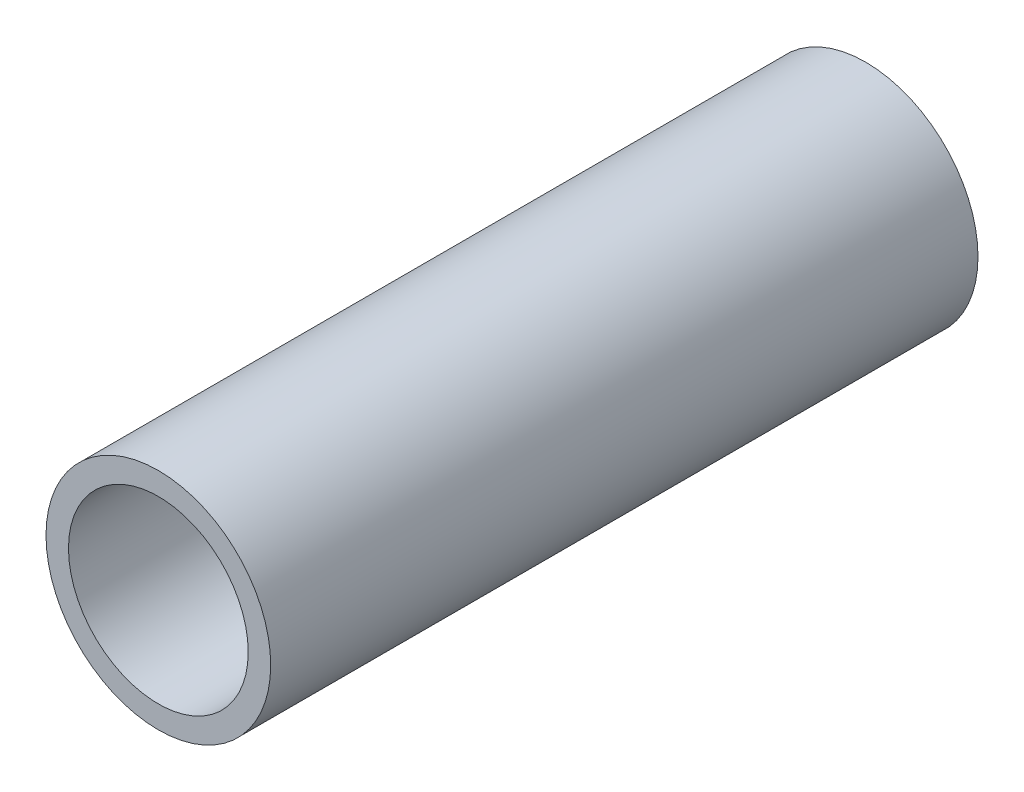
ISO-10303-21;
HEADER;
FILE_DESCRIPTION(('STEP AP214'),'2;1');
FILE_NAME('part.step','',(''),(''),'','','');
FILE_SCHEMA(('AUTOMOTIVE_DESIGN { 1 0 10303 214 1 1 1 1 }'));
ENDSEC;
DATA;
#1=APPLICATION_CONTEXT('core data for automotive mechanical design processes');
#2=APPLICATION_PROTOCOL_DEFINITION('international standard','automotive_design',2000,#1);
#3=PRODUCT_CONTEXT('',#1,'mechanical');
#4=PRODUCT('Part','Part','',(#3));
#5=PRODUCT_RELATED_PRODUCT_CATEGORY('part','',(#4));
#6=PRODUCT_DEFINITION_FORMATION('','',#4);
#7=PRODUCT_DEFINITION_CONTEXT('part definition',#1,'design');
#8=PRODUCT_DEFINITION('design','',#6,#7);
#9=PRODUCT_DEFINITION_SHAPE('','',#8);
#10=(LENGTH_UNIT() NAMED_UNIT(*) SI_UNIT(.MILLI.,.METRE.));
#11=(NAMED_UNIT(*) PLANE_ANGLE_UNIT() SI_UNIT($,.RADIAN.));
#12=(NAMED_UNIT(*) SI_UNIT($,.STERADIAN.) SOLID_ANGLE_UNIT());
#13=UNCERTAINTY_MEASURE_WITH_UNIT(LENGTH_MEASURE(1.E-05),#10,'distance_accuracy_value','');
#14=(GEOMETRIC_REPRESENTATION_CONTEXT(3) GLOBAL_UNCERTAINTY_ASSIGNED_CONTEXT((#13)) GLOBAL_UNIT_ASSIGNED_CONTEXT((#10,
#11,#12)) REPRESENTATION_CONTEXT('',''));
#15=CARTESIAN_POINT('',(0.,0.,0.));
#16=DIRECTION('',(0.,0.,1.));
#17=DIRECTION('',(1.,0.,0.));
#18=AXIS2_PLACEMENT_3D('',#15,#16,#17);
#19=CARTESIAN_POINT('',(0.,0.,3.99795999999999));
#20=DIRECTION('',(0.,0.,1.));
#21=DIRECTION('',(1.,0.,0.));
#22=AXIS2_PLACEMENT_3D('',#19,#20,#21);
#23=PLANE('',#22);
#24=CARTESIAN_POINT('',(0.,0.,3.99795999999999));
#25=DIRECTION('',(0.,0.,1.));
#26=DIRECTION('',(1.,0.,0.));
#27=AXIS2_PLACEMENT_3D('',#24,#25,#26);
#28=CIRCLE('',#27,0.635);
#29=CARTESIAN_POINT('',(-0.634999999999986,0.,3.99796));
#30=VERTEX_POINT('',#29);
#31=EDGE_CURVE('E10',#30,#30,#28,.T.);
#32=ORIENTED_EDGE('',*,*,#31,.T.);
#33=EDGE_LOOP('',(#32));
#34=FACE_BOUND('',#33,.T.);
#35=CARTESIAN_POINT('',(0.,0.,3.99795999999999));
#36=DIRECTION('',(0.,0.,1.));
#37=DIRECTION('',(1.,0.,0.));
#38=AXIS2_PLACEMENT_3D('',#35,#36,#37);
#39=CIRCLE('',#38,0.508);
#40=CARTESIAN_POINT('',(-0.507999999999986,0.,3.99796));
#41=VERTEX_POINT('',#40);
#42=EDGE_CURVE('E52',#41,#41,#39,.T.);
#43=ORIENTED_EDGE('',*,*,#42,.F.);
#44=EDGE_LOOP('',(#43));
#45=FACE_BOUND('',#44,.T.);
#46=ADVANCED_FACE('F39',(#34,#45),#23,.T.);
#47=CARTESIAN_POINT('',(0.,0.,0.));
#48=DIRECTION('',(0.,0.,1.));
#49=DIRECTION('',(1.,0.,0.));
#50=AXIS2_PLACEMENT_3D('',#47,#48,#49);
#51=PLANE('',#50);
#52=CARTESIAN_POINT('',(0.,0.,0.));
#53=DIRECTION('',(0.,0.,1.));
#54=DIRECTION('',(1.,0.,0.));
#55=AXIS2_PLACEMENT_3D('',#52,#53,#54);
#56=CIRCLE('',#55,0.635);
#57=CARTESIAN_POINT('',(-0.634999999999986,0.,0.));
#58=VERTEX_POINT('',#57);
#59=EDGE_CURVE('E43',#58,#58,#56,.T.);
#60=ORIENTED_EDGE('',*,*,#59,.F.);
#61=EDGE_LOOP('',(#60));
#62=FACE_BOUND('',#61,.T.);
#63=CARTESIAN_POINT('',(0.,0.,0.));
#64=DIRECTION('',(0.,0.,1.));
#65=DIRECTION('',(1.,0.,0.));
#66=AXIS2_PLACEMENT_3D('',#63,#64,#65);
#67=CIRCLE('',#66,0.508);
#68=CARTESIAN_POINT('',(-0.507999999999986,0.,0.));
#69=VERTEX_POINT('',#68);
#70=EDGE_CURVE('E54',#69,#69,#67,.T.);
#71=ORIENTED_EDGE('',*,*,#70,.T.);
#72=EDGE_LOOP('',(#71));
#73=FACE_BOUND('',#72,.T.);
#74=ADVANCED_FACE('F66',(#62,#73),#51,.F.);
#75=CARTESIAN_POINT('',(0.,0.,3.99795999999999));
#76=DIRECTION('',(0.,0.,-1.));
#77=DIRECTION('',(-1.,0.,0.));
#78=AXIS2_PLACEMENT_3D('',#75,#76,#77);
#79=CYLINDRICAL_SURFACE('',#78,0.635);
#80=CARTESIAN_POINT('',(-0.634999999999986,0.,3.99796));
#81=CARTESIAN_POINT('',(-0.634999999999986,0.,3.95631458333333));
#82=CARTESIAN_POINT('',(-0.634999999999986,0.,3.91466916666666));
#83=CARTESIAN_POINT('',(-0.634999999999986,0.,3.83137833333333));
#84=CARTESIAN_POINT('',(-0.634999999999986,0.,3.78973291666666));
#85=CARTESIAN_POINT('',(-0.634999999999986,0.,3.70644208333333));
#86=CARTESIAN_POINT('',(-0.634999999999986,0.,3.66479666666666));
#87=CARTESIAN_POINT('',(-0.634999999999986,0.,3.58150583333333));
#88=CARTESIAN_POINT('',(-0.634999999999986,0.,3.53986041666666));
#89=CARTESIAN_POINT('',(-0.634999999999986,0.,3.45656958333333));
#90=CARTESIAN_POINT('',(-0.634999999999986,0.,3.41492416666666));
#91=CARTESIAN_POINT('',(-0.634999999999986,0.,3.33163333333333));
#92=CARTESIAN_POINT('',(-0.634999999999986,0.,3.28998791666666));
#93=CARTESIAN_POINT('',(-0.634999999999986,0.,3.20669708333333));
#94=CARTESIAN_POINT('',(-0.634999999999986,0.,3.16505166666666));
#95=CARTESIAN_POINT('',(-0.634999999999986,0.,3.08176083333333));
#96=CARTESIAN_POINT('',(-0.634999999999986,0.,3.04011541666666));
#97=CARTESIAN_POINT('',(-0.634999999999986,0.,2.95682458333333));
#98=CARTESIAN_POINT('',(-0.634999999999986,0.,2.91517916666666));
#99=CARTESIAN_POINT('',(-0.634999999999986,0.,2.83188833333333));
#100=CARTESIAN_POINT('',(-0.634999999999986,0.,2.79024291666666));
#101=CARTESIAN_POINT('',(-0.634999999999986,0.,2.70695208333333));
#102=CARTESIAN_POINT('',(-0.634999999999986,0.,2.66530666666666));
#103=CARTESIAN_POINT('',(-0.634999999999986,0.,2.58201583333333));
#104=CARTESIAN_POINT('',(-0.634999999999986,0.,2.54037041666666));
#105=CARTESIAN_POINT('',(-0.634999999999986,0.,2.45707958333333));
#106=CARTESIAN_POINT('',(-0.634999999999986,0.,2.41543416666666));
#107=CARTESIAN_POINT('',(-0.634999999999986,0.,2.33214333333333));
#108=CARTESIAN_POINT('',(-0.634999999999986,0.,2.29049791666666));
#109=CARTESIAN_POINT('',(-0.634999999999986,0.,2.20720708333333));
#110=CARTESIAN_POINT('',(-0.634999999999986,0.,2.16556166666666));
#111=CARTESIAN_POINT('',(-0.634999999999986,0.,2.08227083333333));
#112=CARTESIAN_POINT('',(-0.634999999999986,0.,2.04062541666666));
#113=CARTESIAN_POINT('',(-0.634999999999986,0.,1.95733458333333));
#114=CARTESIAN_POINT('',(-0.634999999999986,0.,1.91568916666666));
#115=CARTESIAN_POINT('',(-0.634999999999986,0.,1.83239833333333));
#116=CARTESIAN_POINT('',(-0.634999999999986,0.,1.79075291666666));
#117=CARTESIAN_POINT('',(-0.634999999999986,0.,1.70746208333333));
#118=CARTESIAN_POINT('',(-0.634999999999986,0.,1.66581666666666));
#119=CARTESIAN_POINT('',(-0.634999999999986,0.,1.58252583333333));
#120=CARTESIAN_POINT('',(-0.634999999999986,0.,1.54088041666666));
#121=CARTESIAN_POINT('',(-0.634999999999986,0.,1.45758958333333));
#122=CARTESIAN_POINT('',(-0.634999999999986,0.,1.41594416666666));
#123=CARTESIAN_POINT('',(-0.634999999999986,0.,1.33265333333333));
#124=CARTESIAN_POINT('',(-0.634999999999986,0.,1.29100791666667));
#125=CARTESIAN_POINT('',(-0.634999999999986,0.,1.20771708333333));
#126=CARTESIAN_POINT('',(-0.634999999999986,0.,1.16607166666667));
#127=CARTESIAN_POINT('',(-0.634999999999986,0.,1.08278083333333));
#128=CARTESIAN_POINT('',(-0.634999999999986,0.,1.04113541666667));
#129=CARTESIAN_POINT('',(-0.634999999999986,0.,0.957844583333332));
#130=CARTESIAN_POINT('',(-0.634999999999986,0.,0.916199166666665));
#131=CARTESIAN_POINT('',(-0.634999999999986,0.,0.832908333333332));
#132=CARTESIAN_POINT('',(-0.634999999999986,0.,0.791262916666665));
#133=CARTESIAN_POINT('',(-0.634999999999986,0.,0.707972083333332));
#134=CARTESIAN_POINT('',(-0.634999999999986,0.,0.666326666666665));
#135=CARTESIAN_POINT('',(-0.634999999999986,0.,0.583035833333332));
#136=CARTESIAN_POINT('',(-0.634999999999986,0.,0.541390416666666));
#137=CARTESIAN_POINT('',(-0.634999999999986,0.,0.458099583333333));
#138=CARTESIAN_POINT('',(-0.634999999999986,0.,0.416454166666666));
#139=CARTESIAN_POINT('',(-0.634999999999986,0.,0.333163333333333));
#140=CARTESIAN_POINT('',(-0.634999999999986,0.,0.291517916666666));
#141=CARTESIAN_POINT('',(-0.634999999999986,0.,0.208227083333333));
#142=CARTESIAN_POINT('',(-0.634999999999986,0.,0.166581666666666));
#143=CARTESIAN_POINT('',(-0.634999999999986,0.,0.083290833333333));
#144=CARTESIAN_POINT('',(-0.634999999999986,0.,0.0416454166666665));
#145=CARTESIAN_POINT('',(-0.634999999999986,0.,0.));
#146=B_SPLINE_CURVE_WITH_KNOTS('',3,(#80,#81,#82,#83,#84,#85,#86,#87,#88,#89,#90,#91,#92,#93,
#94,#95,#96,#97,#98,#99,#100,#101,#102,#103,#104,#105,#106,#107,#108,#109,#110,#111,#112,#113,
#114,#115,#116,#117,#118,#119,#120,#121,#122,#123,#124,#125,#126,#127,#128,#129,#130,#131,#132,
#133,#134,#135,#136,#137,#138,#139,#140,#141,#142,#143,#144,#145),.UNSPECIFIED.,.F.,.F.,(4,2,2,
2,2,2,2,2,2,2,2,2,2,2,2,2,2,2,2,2,2,2,2,2,2,2,2,2,2,2,2,2,4),(0.,0.12493625,0.2498725,
0.37480875,0.499745,0.62468125,0.749617499999999,0.874553749999999,0.99949,1.12442625,1.2493625,
1.37429875,1.499235,1.62417125,1.7491075,1.87404375,1.99898,2.12391625,2.2488525,2.37378875,
2.498725,2.62366125,2.7485975,2.87353375,2.99847,3.12340625,3.2483425,3.37327875,3.498215,
3.62315125,3.7480875,3.87302375,3.99796),.UNSPECIFIED.);
#147=EDGE_CURVE('BSEAM41',#30,#58,#146,.T.);
#148=ORIENTED_EDGE('',*,*,#31,.F.);
#149=ORIENTED_EDGE('',*,*,#59,.T.);
#150=ORIENTED_EDGE('',*,*,#147,.T.);
#151=ORIENTED_EDGE('',*,*,#147,.F.);
#152=EDGE_LOOP('',(#148,#150,#149,#151));
#153=FACE_BOUND('',#152,.T.);
#154=ADVANCED_FACE('F41',(#153),#79,.T.);
#155=CARTESIAN_POINT('',(0.,0.,3.99795999999999));
#156=DIRECTION('',(0.,0.,-1.));
#157=DIRECTION('',(-1.,0.,0.));
#158=AXIS2_PLACEMENT_3D('',#155,#156,#157);
#159=CYLINDRICAL_SURFACE('',#158,0.508);
#160=CARTESIAN_POINT('',(-0.507999999999986,0.,3.99796));
#161=CARTESIAN_POINT('',(-0.507999999999986,0.,3.95631458333333));
#162=CARTESIAN_POINT('',(-0.507999999999986,0.,3.91466916666666));
#163=CARTESIAN_POINT('',(-0.507999999999986,0.,3.83137833333333));
#164=CARTESIAN_POINT('',(-0.507999999999986,0.,3.78973291666666));
#165=CARTESIAN_POINT('',(-0.507999999999986,0.,3.70644208333333));
#166=CARTESIAN_POINT('',(-0.507999999999986,0.,3.66479666666666));
#167=CARTESIAN_POINT('',(-0.507999999999986,0.,3.58150583333333));
#168=CARTESIAN_POINT('',(-0.507999999999986,0.,3.53986041666666));
#169=CARTESIAN_POINT('',(-0.507999999999986,0.,3.45656958333333));
#170=CARTESIAN_POINT('',(-0.507999999999986,0.,3.41492416666666));
#171=CARTESIAN_POINT('',(-0.507999999999986,0.,3.33163333333333));
#172=CARTESIAN_POINT('',(-0.507999999999986,0.,3.28998791666666));
#173=CARTESIAN_POINT('',(-0.507999999999986,0.,3.20669708333333));
#174=CARTESIAN_POINT('',(-0.507999999999986,0.,3.16505166666666));
#175=CARTESIAN_POINT('',(-0.507999999999986,0.,3.08176083333333));
#176=CARTESIAN_POINT('',(-0.507999999999986,0.,3.04011541666666));
#177=CARTESIAN_POINT('',(-0.507999999999986,0.,2.95682458333333));
#178=CARTESIAN_POINT('',(-0.507999999999986,0.,2.91517916666666));
#179=CARTESIAN_POINT('',(-0.507999999999986,0.,2.83188833333333));
#180=CARTESIAN_POINT('',(-0.507999999999986,0.,2.79024291666666));
#181=CARTESIAN_POINT('',(-0.507999999999986,0.,2.70695208333333));
#182=CARTESIAN_POINT('',(-0.507999999999986,0.,2.66530666666666));
#183=CARTESIAN_POINT('',(-0.507999999999986,0.,2.58201583333333));
#184=CARTESIAN_POINT('',(-0.507999999999986,0.,2.54037041666666));
#185=CARTESIAN_POINT('',(-0.507999999999986,0.,2.45707958333333));
#186=CARTESIAN_POINT('',(-0.507999999999986,0.,2.41543416666666));
#187=CARTESIAN_POINT('',(-0.507999999999986,0.,2.33214333333333));
#188=CARTESIAN_POINT('',(-0.507999999999986,0.,2.29049791666666));
#189=CARTESIAN_POINT('',(-0.507999999999986,0.,2.20720708333333));
#190=CARTESIAN_POINT('',(-0.507999999999986,0.,2.16556166666666));
#191=CARTESIAN_POINT('',(-0.507999999999986,0.,2.08227083333333));
#192=CARTESIAN_POINT('',(-0.507999999999986,0.,2.04062541666666));
#193=CARTESIAN_POINT('',(-0.507999999999986,0.,1.95733458333333));
#194=CARTESIAN_POINT('',(-0.507999999999986,0.,1.91568916666666));
#195=CARTESIAN_POINT('',(-0.507999999999986,0.,1.83239833333333));
#196=CARTESIAN_POINT('',(-0.507999999999986,0.,1.79075291666666));
#197=CARTESIAN_POINT('',(-0.507999999999986,0.,1.70746208333333));
#198=CARTESIAN_POINT('',(-0.507999999999986,0.,1.66581666666666));
#199=CARTESIAN_POINT('',(-0.507999999999986,0.,1.58252583333333));
#200=CARTESIAN_POINT('',(-0.507999999999986,0.,1.54088041666666));
#201=CARTESIAN_POINT('',(-0.507999999999986,0.,1.45758958333333));
#202=CARTESIAN_POINT('',(-0.507999999999986,0.,1.41594416666666));
#203=CARTESIAN_POINT('',(-0.507999999999986,0.,1.33265333333333));
#204=CARTESIAN_POINT('',(-0.507999999999986,0.,1.29100791666667));
#205=CARTESIAN_POINT('',(-0.507999999999986,0.,1.20771708333333));
#206=CARTESIAN_POINT('',(-0.507999999999986,0.,1.16607166666667));
#207=CARTESIAN_POINT('',(-0.507999999999986,0.,1.08278083333333));
#208=CARTESIAN_POINT('',(-0.507999999999986,0.,1.04113541666667));
#209=CARTESIAN_POINT('',(-0.507999999999986,0.,0.957844583333332));
#210=CARTESIAN_POINT('',(-0.507999999999986,0.,0.916199166666665));
#211=CARTESIAN_POINT('',(-0.507999999999986,0.,0.832908333333332));
#212=CARTESIAN_POINT('',(-0.507999999999986,0.,0.791262916666665));
#213=CARTESIAN_POINT('',(-0.507999999999986,0.,0.707972083333332));
#214=CARTESIAN_POINT('',(-0.507999999999986,0.,0.666326666666665));
#215=CARTESIAN_POINT('',(-0.507999999999986,0.,0.583035833333332));
#216=CARTESIAN_POINT('',(-0.507999999999986,0.,0.541390416666666));
#217=CARTESIAN_POINT('',(-0.507999999999986,0.,0.458099583333333));
#218=CARTESIAN_POINT('',(-0.507999999999986,0.,0.416454166666666));
#219=CARTESIAN_POINT('',(-0.507999999999986,0.,0.333163333333333));
#220=CARTESIAN_POINT('',(-0.507999999999986,0.,0.291517916666666));
#221=CARTESIAN_POINT('',(-0.507999999999986,0.,0.208227083333333));
#222=CARTESIAN_POINT('',(-0.507999999999986,0.,0.166581666666666));
#223=CARTESIAN_POINT('',(-0.507999999999986,0.,0.083290833333333));
#224=CARTESIAN_POINT('',(-0.507999999999986,0.,0.0416454166666665));
#225=CARTESIAN_POINT('',(-0.507999999999986,0.,0.));
#226=B_SPLINE_CURVE_WITH_KNOTS('',3,(#160,#161,#162,#163,#164,#165,#166,#167,#168,#169,#170,
#171,#172,#173,#174,#175,#176,#177,#178,#179,#180,#181,#182,#183,#184,#185,#186,#187,#188,#189,
#190,#191,#192,#193,#194,#195,#196,#197,#198,#199,#200,#201,#202,#203,#204,#205,#206,#207,#208,
#209,#210,#211,#212,#213,#214,#215,#216,#217,#218,#219,#220,#221,#222,#223,#224,#225),
.UNSPECIFIED.,.F.,.F.,(4,2,2,2,2,2,2,2,2,2,2,2,2,2,2,2,2,2,2,2,2,2,2,2,2,2,2,2,2,2,2,2,4),(0.,
0.12493625,0.2498725,0.37480875,0.499745,0.62468125,0.749617499999999,0.874553749999999,0.99949,
1.12442625,1.2493625,1.37429875,1.499235,1.62417125,1.7491075,1.87404375,1.99898,2.12391625,
2.2488525,2.37378875,2.498725,2.62366125,2.7485975,2.87353375,2.99847,3.12340625,3.2483425,
3.37327875,3.498215,3.62315125,3.7480875,3.87302375,3.99796),.UNSPECIFIED.);
#227=EDGE_CURVE('BSEAM62',#41,#69,#226,.T.);
#228=ORIENTED_EDGE('',*,*,#42,.T.);
#229=ORIENTED_EDGE('',*,*,#70,.F.);
#230=ORIENTED_EDGE('',*,*,#227,.T.);
#231=ORIENTED_EDGE('',*,*,#227,.F.);
#232=EDGE_LOOP('',(#228,#230,#229,#231));
#233=FACE_BOUND('',#232,.T.);
#234=ADVANCED_FACE('F62',(#233),#159,.F.);
#235=CLOSED_SHELL('',(#46,#74,#154,#234));
#236=MANIFOLD_SOLID_BREP('B2',#235);
#237=ADVANCED_BREP_SHAPE_REPRESENTATION('',(#18,#236),#14);
#238=SHAPE_DEFINITION_REPRESENTATION(#9,#237);
ENDSEC;
END-ISO-10303-21;
